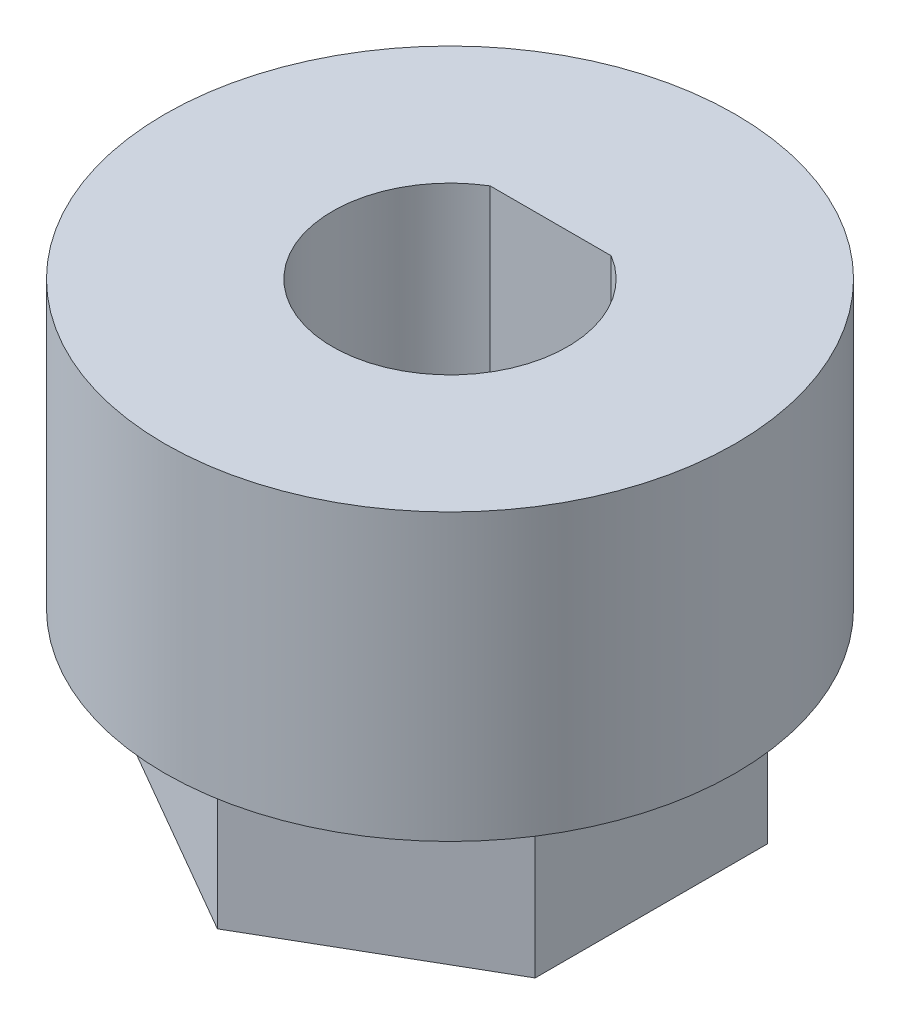
ISO-10303-21;
HEADER;
FILE_DESCRIPTION(('STEP AP214'),'2;1');
FILE_NAME('part.step','',(''),(''),'','','');
FILE_SCHEMA(('AUTOMOTIVE_DESIGN { 1 0 10303 214 1 1 1 1 }'));
ENDSEC;
DATA;
#1=APPLICATION_CONTEXT('core data for automotive mechanical design processes');
#2=APPLICATION_PROTOCOL_DEFINITION('international standard','automotive_design',2000,#1);
#3=PRODUCT_CONTEXT('',#1,'mechanical');
#4=PRODUCT('Part','Part','',(#3));
#5=PRODUCT_RELATED_PRODUCT_CATEGORY('part','',(#4));
#6=PRODUCT_DEFINITION_FORMATION('','',#4);
#7=PRODUCT_DEFINITION_CONTEXT('part definition',#1,'design');
#8=PRODUCT_DEFINITION('design','',#6,#7);
#9=PRODUCT_DEFINITION_SHAPE('','',#8);
#10=(LENGTH_UNIT() NAMED_UNIT(*) SI_UNIT(.MILLI.,.METRE.));
#11=(NAMED_UNIT(*) PLANE_ANGLE_UNIT() SI_UNIT($,.RADIAN.));
#12=(NAMED_UNIT(*) SI_UNIT($,.STERADIAN.) SOLID_ANGLE_UNIT());
#13=UNCERTAINTY_MEASURE_WITH_UNIT(LENGTH_MEASURE(1.E-05),#10,'distance_accuracy_value','');
#14=(GEOMETRIC_REPRESENTATION_CONTEXT(3) GLOBAL_UNCERTAINTY_ASSIGNED_CONTEXT((#13)) GLOBAL_UNIT_ASSIGNED_CONTEXT((#10,
#11,#12)) REPRESENTATION_CONTEXT('',''));
#15=CARTESIAN_POINT('',(0.,0.,0.));
#16=DIRECTION('',(0.,0.,1.));
#17=DIRECTION('',(1.,0.,0.));
#18=AXIS2_PLACEMENT_3D('',#15,#16,#17);
#19=CARTESIAN_POINT('',(0.,4.8,-6.9282032302755));
#20=DIRECTION('',(-0.499999999999998,0.,0.86602540378444));
#21=DIRECTION('',(0.86602540378444,0.,0.499999999999998));
#22=AXIS2_PLACEMENT_3D('',#19,#20,#21);
#23=PLANE('',#22);
#24=DIRECTION('',(-0.86602540378444,0.,-0.499999999999998));
#25=VECTOR('',#24,1.);
#26=CARTESIAN_POINT('',(0.,0.,-6.9282032302755));
#27=LINE('',#26,#25);
#28=CARTESIAN_POINT('',(5.99999999999997,0.,-3.46410161513778));
#29=VERTEX_POINT('',#28);
#30=CARTESIAN_POINT('',(0.,0.,-6.9282032302755));
#31=VERTEX_POINT('',#30);
#32=EDGE_CURVE('E136',#29,#31,#27,.T.);
#33=ORIENTED_EDGE('',*,*,#32,.T.);
#34=DIRECTION('',(0.,-1.,0.));
#35=VECTOR('',#34,1.);
#36=CARTESIAN_POINT('',(0.,4.8,-6.9282032302755));
#37=LINE('',#36,#35);
#38=CARTESIAN_POINT('',(0.,4.8,-6.9282032302755));
#39=VERTEX_POINT('',#38);
#40=EDGE_CURVE('E11',#39,#31,#37,.T.);
#41=ORIENTED_EDGE('',*,*,#40,.F.);
#42=DIRECTION('',(-0.86602540378444,0.,-0.499999999999998));
#43=VECTOR('',#42,1.);
#44=CARTESIAN_POINT('',(0.,4.8,-6.9282032302755));
#45=LINE('',#44,#43);
#46=CARTESIAN_POINT('',(5.99999999999997,4.8,-3.46410161513778));
#47=VERTEX_POINT('',#46);
#48=EDGE_CURVE('E140',#47,#39,#45,.T.);
#49=ORIENTED_EDGE('',*,*,#48,.F.);
#50=DIRECTION('',(0.,-1.,0.));
#51=VECTOR('',#50,1.);
#52=CARTESIAN_POINT('',(5.99999999999997,4.8,-3.46410161513778));
#53=LINE('',#52,#51);
#54=EDGE_CURVE('E165',#47,#29,#53,.T.);
#55=ORIENTED_EDGE('',*,*,#54,.T.);
#56=EDGE_LOOP('',(#33,#41,#49,#55));
#57=FACE_BOUND('',#56,.T.);
#58=ADVANCED_FACE('F43',(#57),#23,.F.);
#59=CARTESIAN_POINT('',(-6.00000000000003,4.8,-3.46410161513769));
#60=DIRECTION('',(0.500000000000004,0.,0.866025403784436));
#61=DIRECTION('',(0.866025403784436,0.,-0.500000000000004));
#62=AXIS2_PLACEMENT_3D('',#59,#60,#61);
#63=PLANE('',#62);
#64=DIRECTION('',(-0.866025403784436,0.,0.500000000000004));
#65=VECTOR('',#64,1.);
#66=CARTESIAN_POINT('',(-6.00000000000003,0.,-3.46410161513769));
#67=LINE('',#66,#65);
#68=CARTESIAN_POINT('',(-6.00000000000003,0.,-3.46410161513769));
#69=VERTEX_POINT('',#68);
#70=EDGE_CURVE('E169',#31,#69,#67,.T.);
#71=ORIENTED_EDGE('',*,*,#70,.T.);
#72=DIRECTION('',(0.,-1.,0.));
#73=VECTOR('',#72,1.);
#74=CARTESIAN_POINT('',(-6.00000000000003,4.8,-3.46410161513769));
#75=LINE('',#74,#73);
#76=CARTESIAN_POINT('',(-6.00000000000003,4.8,-3.46410161513769));
#77=VERTEX_POINT('',#76);
#78=EDGE_CURVE('E51',#77,#69,#75,.T.);
#79=ORIENTED_EDGE('',*,*,#78,.F.);
#80=DIRECTION('',(-0.866025403784436,0.,0.500000000000004));
#81=VECTOR('',#80,1.);
#82=CARTESIAN_POINT('',(-6.00000000000003,4.8,-3.46410161513769));
#83=LINE('',#82,#81);
#84=EDGE_CURVE('E144',#39,#77,#83,.T.);
#85=ORIENTED_EDGE('',*,*,#84,.F.);
#86=ORIENTED_EDGE('',*,*,#40,.T.);
#87=EDGE_LOOP('',(#71,#79,#85,#86));
#88=FACE_BOUND('',#87,.T.);
#89=ADVANCED_FACE('F218',(#88),#63,.F.);
#90=CARTESIAN_POINT('',(-5.99999999999997,4.8,3.46410161513778));
#91=DIRECTION('',(1.,0.,0.));
#92=DIRECTION('',(0.,0.,-1.));
#93=AXIS2_PLACEMENT_3D('',#90,#91,#92);
#94=PLANE('',#93);
#95=DIRECTION('',(0.,0.,1.));
#96=VECTOR('',#95,1.);
#97=CARTESIAN_POINT('',(-5.99999999999997,0.,3.46410161513778));
#98=LINE('',#97,#96);
#99=CARTESIAN_POINT('',(-5.99999999999997,0.,3.46410161513778));
#100=VERTEX_POINT('',#99);
#101=EDGE_CURVE('E172',#69,#100,#98,.T.);
#102=ORIENTED_EDGE('',*,*,#101,.T.);
#103=DIRECTION('',(0.,-1.,0.));
#104=VECTOR('',#103,1.);
#105=CARTESIAN_POINT('',(-5.99999999999997,4.8,3.46410161513778));
#106=LINE('',#105,#104);
#107=CARTESIAN_POINT('',(-5.99999999999997,4.8,3.46410161513778));
#108=VERTEX_POINT('',#107);
#109=EDGE_CURVE('E194',#108,#100,#106,.T.);
#110=ORIENTED_EDGE('',*,*,#109,.F.);
#111=DIRECTION('',(0.,0.,1.));
#112=VECTOR('',#111,1.);
#113=CARTESIAN_POINT('',(-5.99999999999997,4.8,3.46410161513778));
#114=LINE('',#113,#112);
#115=EDGE_CURVE('E149',#77,#108,#114,.T.);
#116=ORIENTED_EDGE('',*,*,#115,.F.);
#117=ORIENTED_EDGE('',*,*,#78,.T.);
#118=EDGE_LOOP('',(#102,#110,#116,#117));
#119=FACE_BOUND('',#118,.T.);
#120=ADVANCED_FACE('F202',(#119),#94,.F.);
#121=CARTESIAN_POINT('',(0.,4.8,6.9282032302755));
#122=DIRECTION('',(0.499999999999998,0.,-0.86602540378444));
#123=DIRECTION('',(-0.86602540378444,0.,-0.499999999999998));
#124=AXIS2_PLACEMENT_3D('',#121,#122,#123);
#125=PLANE('',#124);
#126=DIRECTION('',(0.86602540378444,0.,0.499999999999998));
#127=VECTOR('',#126,1.);
#128=CARTESIAN_POINT('',(0.,0.,6.9282032302755));
#129=LINE('',#128,#127);
#130=CARTESIAN_POINT('',(0.,0.,6.9282032302755));
#131=VERTEX_POINT('',#130);
#132=EDGE_CURVE('E175',#100,#131,#129,.T.);
#133=ORIENTED_EDGE('',*,*,#132,.T.);
#134=DIRECTION('',(0.,-1.,0.));
#135=VECTOR('',#134,1.);
#136=CARTESIAN_POINT('',(0.,4.8,6.9282032302755));
#137=LINE('',#136,#135);
#138=CARTESIAN_POINT('',(0.,4.8,6.9282032302755));
#139=VERTEX_POINT('',#138);
#140=EDGE_CURVE('E190',#139,#131,#137,.T.);
#141=ORIENTED_EDGE('',*,*,#140,.F.);
#142=DIRECTION('',(0.86602540378444,0.,0.499999999999998));
#143=VECTOR('',#142,1.);
#144=CARTESIAN_POINT('',(0.,4.8,6.9282032302755));
#145=LINE('',#144,#143);
#146=EDGE_CURVE('E153',#108,#139,#145,.T.);
#147=ORIENTED_EDGE('',*,*,#146,.F.);
#148=ORIENTED_EDGE('',*,*,#109,.T.);
#149=EDGE_LOOP('',(#133,#141,#147,#148));
#150=FACE_BOUND('',#149,.T.);
#151=ADVANCED_FACE('F209',(#150),#125,.F.);
#152=CARTESIAN_POINT('',(6.00000000000003,4.8,3.46410161513769));
#153=DIRECTION('',(-0.500000000000005,0.,-0.866025403784436));
#154=DIRECTION('',(-0.866025403784436,0.,0.500000000000005));
#155=AXIS2_PLACEMENT_3D('',#152,#153,#154);
#156=PLANE('',#155);
#157=DIRECTION('',(0.866025403784436,0.,-0.500000000000005));
#158=VECTOR('',#157,1.);
#159=CARTESIAN_POINT('',(6.00000000000003,0.,3.46410161513769));
#160=LINE('',#159,#158);
#161=CARTESIAN_POINT('',(6.00000000000003,0.,3.46410161513769));
#162=VERTEX_POINT('',#161);
#163=EDGE_CURVE('E178',#131,#162,#160,.T.);
#164=ORIENTED_EDGE('',*,*,#163,.T.);
#165=DIRECTION('',(0.,-1.,0.));
#166=VECTOR('',#165,1.);
#167=CARTESIAN_POINT('',(6.00000000000003,4.8,3.46410161513769));
#168=LINE('',#167,#166);
#169=CARTESIAN_POINT('',(6.00000000000003,4.8,3.46410161513769));
#170=VERTEX_POINT('',#169);
#171=EDGE_CURVE('E186',#170,#162,#168,.T.);
#172=ORIENTED_EDGE('',*,*,#171,.F.);
#173=DIRECTION('',(0.866025403784436,0.,-0.500000000000005));
#174=VECTOR('',#173,1.);
#175=CARTESIAN_POINT('',(6.00000000000003,4.8,3.46410161513769));
#176=LINE('',#175,#174);
#177=EDGE_CURVE('E157',#139,#170,#176,.T.);
#178=ORIENTED_EDGE('',*,*,#177,.F.);
#179=ORIENTED_EDGE('',*,*,#140,.T.);
#180=EDGE_LOOP('',(#164,#172,#178,#179));
#181=FACE_BOUND('',#180,.T.);
#182=ADVANCED_FACE('F213',(#181),#156,.F.);
#183=CARTESIAN_POINT('',(5.99999999999997,4.8,-3.46410161513778));
#184=DIRECTION('',(-1.,0.,0.));
#185=DIRECTION('',(0.,0.,1.));
#186=AXIS2_PLACEMENT_3D('',#183,#184,#185);
#187=PLANE('',#186);
#188=DIRECTION('',(0.,0.,-1.));
#189=VECTOR('',#188,1.);
#190=CARTESIAN_POINT('',(5.99999999999997,0.,-3.46410161513778));
#191=LINE('',#190,#189);
#192=EDGE_CURVE('E145',#162,#29,#191,.T.);
#193=ORIENTED_EDGE('',*,*,#192,.T.);
#194=ORIENTED_EDGE('',*,*,#54,.F.);
#195=DIRECTION('',(0.,0.,-1.));
#196=VECTOR('',#195,1.);
#197=CARTESIAN_POINT('',(5.99999999999997,4.8,-3.46410161513778));
#198=LINE('',#197,#196);
#199=EDGE_CURVE('E161',#170,#47,#198,.T.);
#200=ORIENTED_EDGE('',*,*,#199,.F.);
#201=ORIENTED_EDGE('',*,*,#171,.T.);
#202=EDGE_LOOP('',(#193,#194,#200,#201));
#203=FACE_BOUND('',#202,.T.);
#204=ADVANCED_FACE('F222',(#203),#187,.F.);
#205=CARTESIAN_POINT('',(0.,0.,0.));
#206=DIRECTION('',(0.,-1.,0.));
#207=DIRECTION('',(0.,0.,-1.));
#208=AXIS2_PLACEMENT_3D('',#205,#206,#207);
#209=PLANE('',#208);
#210=CARTESIAN_POINT('',(0.,0.,0.));
#211=DIRECTION('',(0.,1.,0.));
#212=DIRECTION('',(0.,0.,1.));
#213=AXIS2_PLACEMENT_3D('',#210,#211,#212);
#214=CIRCLE('',#213,3.5);
#215=CARTESIAN_POINT('',(-1.802775637732,0.,-3.));
#216=VERTEX_POINT('',#215);
#217=CARTESIAN_POINT('',(1.802775637732,0.,-3.));
#218=VERTEX_POINT('',#217);
#219=EDGE_CURVE('E58',#216,#218,#214,.T.);
#220=ORIENTED_EDGE('',*,*,#219,.T.);
#221=DIRECTION('',(-1.,0.,0.));
#222=VECTOR('',#221,1.);
#223=CARTESIAN_POINT('',(-1.802775637732,0.,-3.));
#224=LINE('',#223,#222);
#225=EDGE_CURVE('E112',#218,#216,#224,.T.);
#226=ORIENTED_EDGE('',*,*,#225,.T.);
#227=EDGE_LOOP('',(#220,#226));
#228=FACE_BOUND('',#227,.T.);
#229=ORIENTED_EDGE('',*,*,#32,.F.);
#230=ORIENTED_EDGE('',*,*,#192,.F.);
#231=ORIENTED_EDGE('',*,*,#163,.F.);
#232=ORIENTED_EDGE('',*,*,#132,.F.);
#233=ORIENTED_EDGE('',*,*,#101,.F.);
#234=ORIENTED_EDGE('',*,*,#70,.F.);
#235=EDGE_LOOP('',(#229,#230,#231,#232,#233,#234));
#236=FACE_BOUND('',#235,.T.);
#237=ADVANCED_FACE('F119',(#228,#236),#209,.T.);
#238=CARTESIAN_POINT('',(0.,4.8,0.));
#239=DIRECTION('',(0.,1.,0.));
#240=DIRECTION('',(0.,0.,1.));
#241=AXIS2_PLACEMENT_3D('',#238,#239,#240);
#242=PLANE('',#241);
#243=CARTESIAN_POINT('',(0.,4.8,0.));
#244=DIRECTION('',(0.,1.,0.));
#245=DIRECTION('',(0.,0.,1.));
#246=AXIS2_PLACEMENT_3D('',#243,#244,#245);
#247=CIRCLE('',#246,8.5);
#248=CARTESIAN_POINT('',(0.,4.8,8.5));
#249=VERTEX_POINT('',#248);
#250=EDGE_CURVE('E130',#249,#249,#247,.T.);
#251=ORIENTED_EDGE('',*,*,#250,.F.);
#252=EDGE_LOOP('',(#251));
#253=FACE_BOUND('',#252,.T.);
#254=ORIENTED_EDGE('',*,*,#199,.T.);
#255=ORIENTED_EDGE('',*,*,#48,.T.);
#256=ORIENTED_EDGE('',*,*,#84,.T.);
#257=ORIENTED_EDGE('',*,*,#115,.T.);
#258=ORIENTED_EDGE('',*,*,#146,.T.);
#259=ORIENTED_EDGE('',*,*,#177,.T.);
#260=EDGE_LOOP('',(#254,#255,#256,#257,#258,#259));
#261=FACE_BOUND('',#260,.T.);
#262=ADVANCED_FACE('F216',(#253,#261),#242,.F.);
#263=CARTESIAN_POINT('',(0.,13.3,0.));
#264=DIRECTION('',(0.,-1.,0.));
#265=DIRECTION('',(0.,0.,-1.));
#266=AXIS2_PLACEMENT_3D('',#263,#264,#265);
#267=CYLINDRICAL_SURFACE('',#266,8.5);
#268=CARTESIAN_POINT('',(0.,13.3,0.));
#269=DIRECTION('',(0.,1.,0.));
#270=DIRECTION('',(0.,0.,1.));
#271=AXIS2_PLACEMENT_3D('',#268,#269,#270);
#272=CIRCLE('',#271,8.5);
#273=CARTESIAN_POINT('',(0.,13.3,8.5));
#274=VERTEX_POINT('',#273);
#275=EDGE_CURVE('E132',#274,#274,#272,.T.);
#276=ORIENTED_EDGE('',*,*,#275,.F.);
#277=EDGE_LOOP('',(#276));
#278=FACE_BOUND('',#277,.T.);
#279=ORIENTED_EDGE('',*,*,#250,.T.);
#280=EDGE_LOOP('',(#279));
#281=FACE_BOUND('',#280,.T.);
#282=ADVANCED_FACE('F265',(#278,#281),#267,.T.);
#283=CARTESIAN_POINT('',(0.,13.3,0.));
#284=DIRECTION('',(0.,1.,0.));
#285=DIRECTION('',(0.,0.,1.));
#286=AXIS2_PLACEMENT_3D('',#283,#284,#285);
#287=PLANE('',#286);
#288=CARTESIAN_POINT('',(0.,13.3,0.));
#289=DIRECTION('',(0.,1.,0.));
#290=DIRECTION('',(0.,0.,1.));
#291=AXIS2_PLACEMENT_3D('',#288,#289,#290);
#292=CIRCLE('',#291,3.5);
#293=CARTESIAN_POINT('',(-1.802775637732,13.3,-3.));
#294=VERTEX_POINT('',#293);
#295=CARTESIAN_POINT('',(1.802775637732,13.3,-3.));
#296=VERTEX_POINT('',#295);
#297=EDGE_CURVE('E63',#294,#296,#292,.T.);
#298=ORIENTED_EDGE('',*,*,#297,.F.);
#299=DIRECTION('',(-1.,0.,0.));
#300=VECTOR('',#299,1.);
#301=CARTESIAN_POINT('',(-1.802775637732,13.3,-3.));
#302=LINE('',#301,#300);
#303=EDGE_CURVE('E122',#296,#294,#302,.T.);
#304=ORIENTED_EDGE('',*,*,#303,.F.);
#305=EDGE_LOOP('',(#298,#304));
#306=FACE_BOUND('',#305,.T.);
#307=ORIENTED_EDGE('',*,*,#275,.T.);
#308=EDGE_LOOP('',(#307));
#309=FACE_BOUND('',#308,.T.);
#310=ADVANCED_FACE('F276',(#306,#309),#287,.T.);
#311=CARTESIAN_POINT('',(0.,0.,0.));
#312=DIRECTION('',(0.,1.,0.));
#313=DIRECTION('',(0.,0.,1.));
#314=AXIS2_PLACEMENT_3D('',#311,#312,#313);
#315=CYLINDRICAL_SURFACE('',#314,3.5);
#316=ORIENTED_EDGE('',*,*,#297,.T.);
#317=DIRECTION('',(0.,1.,0.));
#318=VECTOR('',#317,1.);
#319=CARTESIAN_POINT('',(1.802775637732,0.,-3.));
#320=LINE('',#319,#318);
#321=EDGE_CURVE('E104',#218,#296,#320,.T.);
#322=ORIENTED_EDGE('',*,*,#321,.F.);
#323=ORIENTED_EDGE('',*,*,#219,.F.);
#324=DIRECTION('',(0.,1.,0.));
#325=VECTOR('',#324,1.);
#326=CARTESIAN_POINT('',(-1.802775637732,0.,-3.));
#327=LINE('',#326,#325);
#328=EDGE_CURVE('E111',#216,#294,#327,.T.);
#329=ORIENTED_EDGE('',*,*,#328,.T.);
#330=EDGE_LOOP('',(#316,#322,#323,#329));
#331=FACE_BOUND('',#330,.T.);
#332=ADVANCED_FACE('F106',(#331),#315,.F.);
#333=CARTESIAN_POINT('',(-1.802775637732,0.,-3.));
#334=DIRECTION('',(0.,0.,-1.));
#335=DIRECTION('',(-1.,0.,0.));
#336=AXIS2_PLACEMENT_3D('',#333,#334,#335);
#337=PLANE('',#336);
#338=ORIENTED_EDGE('',*,*,#303,.T.);
#339=ORIENTED_EDGE('',*,*,#328,.F.);
#340=ORIENTED_EDGE('',*,*,#225,.F.);
#341=ORIENTED_EDGE('',*,*,#321,.T.);
#342=EDGE_LOOP('',(#338,#339,#340,#341));
#343=FACE_BOUND('',#342,.T.);
#344=ADVANCED_FACE('F115',(#343),#337,.F.);
#345=CLOSED_SHELL('',(#58,#89,#120,#151,#182,#204,#237,#262,#282,#310,#332,#344));
#346=MANIFOLD_SOLID_BREP('B2',#345);
#347=ADVANCED_BREP_SHAPE_REPRESENTATION('',(#18,#346),#14);
#348=SHAPE_DEFINITION_REPRESENTATION(#9,#347);
ENDSEC;
END-ISO-10303-21;
